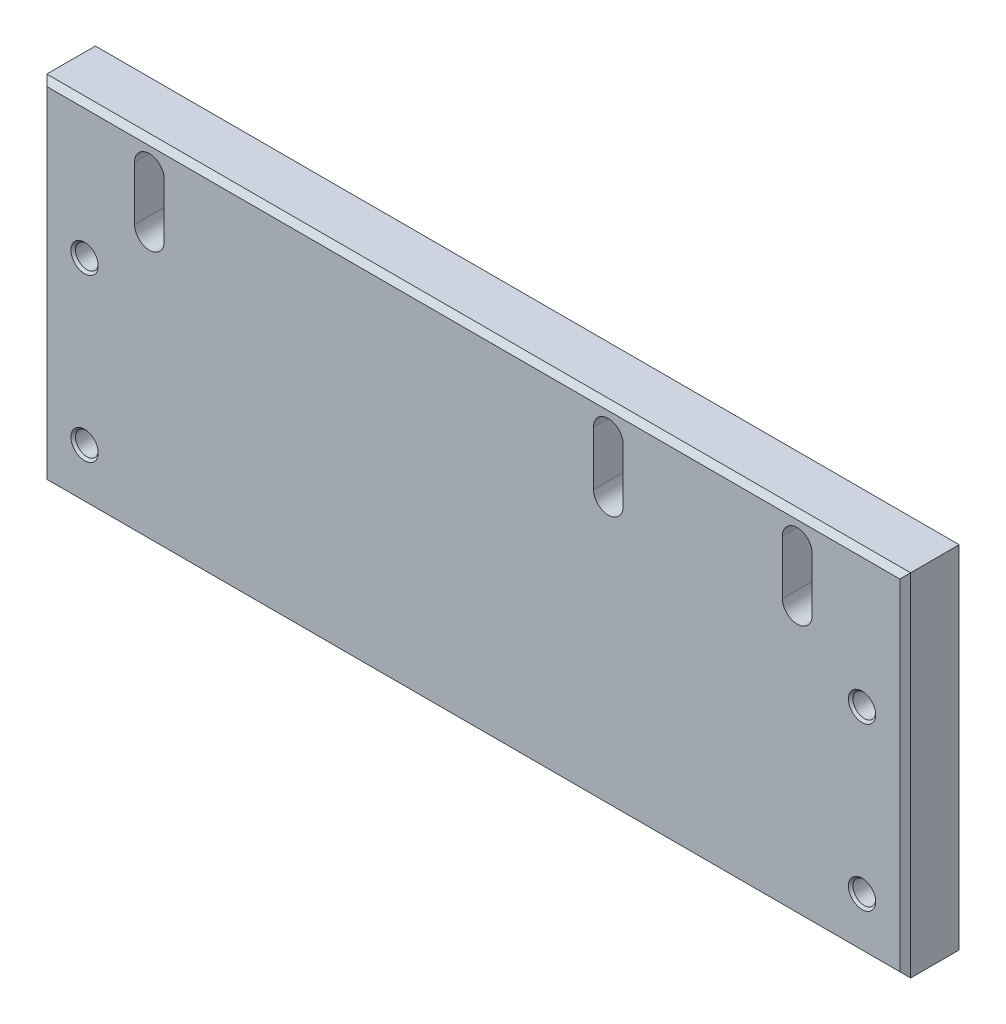
ISO-10303-21;
HEADER;
FILE_DESCRIPTION(('STEP AP214'),'2;1');
FILE_NAME('part.step','',(''),(''),'','','');
FILE_SCHEMA(('AUTOMOTIVE_DESIGN { 1 0 10303 214 1 1 1 1 }'));
ENDSEC;
DATA;
#1=APPLICATION_CONTEXT('core data for automotive mechanical design processes');
#2=APPLICATION_PROTOCOL_DEFINITION('international standard','automotive_design',2000,#1);
#3=PRODUCT_CONTEXT('',#1,'mechanical');
#4=PRODUCT('Part','Part','',(#3));
#5=PRODUCT_RELATED_PRODUCT_CATEGORY('part','',(#4));
#6=PRODUCT_DEFINITION_FORMATION('','',#4);
#7=PRODUCT_DEFINITION_CONTEXT('part definition',#1,'design');
#8=PRODUCT_DEFINITION('design','',#6,#7);
#9=PRODUCT_DEFINITION_SHAPE('','',#8);
#10=(LENGTH_UNIT() NAMED_UNIT(*) SI_UNIT(.MILLI.,.METRE.));
#11=(NAMED_UNIT(*) PLANE_ANGLE_UNIT() SI_UNIT($,.RADIAN.));
#12=(NAMED_UNIT(*) SI_UNIT($,.STERADIAN.) SOLID_ANGLE_UNIT());
#13=UNCERTAINTY_MEASURE_WITH_UNIT(LENGTH_MEASURE(1.E-05),#10,'distance_accuracy_value','');
#14=(GEOMETRIC_REPRESENTATION_CONTEXT(3) GLOBAL_UNCERTAINTY_ASSIGNED_CONTEXT((#13)) GLOBAL_UNIT_ASSIGNED_CONTEXT((#10,
#11,#12)) REPRESENTATION_CONTEXT('',''));
#15=CARTESIAN_POINT('',(0.,0.,0.));
#16=DIRECTION('',(0.,0.,1.));
#17=DIRECTION('',(1.,0.,0.));
#18=AXIS2_PLACEMENT_3D('',#15,#16,#17);
#19=CARTESIAN_POINT('',(-80.,32.5,10.));
#20=DIRECTION('',(1.,0.,0.));
#21=DIRECTION('',(0.,0.,-1.));
#22=AXIS2_PLACEMENT_3D('',#19,#20,#21);
#23=PLANE('',#22);
#24=DIRECTION('',(0.,0.,-1.));
#25=VECTOR('',#24,1.);
#26=CARTESIAN_POINT('',(-80.,-32.5,10.));
#27=LINE('',#26,#25);
#28=CARTESIAN_POINT('',(-80.,-32.5,9.));
#29=VERTEX_POINT('',#28);
#30=CARTESIAN_POINT('',(-80.,-32.5,0.));
#31=VERTEX_POINT('',#30);
#32=EDGE_CURVE('E314',#29,#31,#27,.T.);
#33=ORIENTED_EDGE('',*,*,#32,.F.);
#34=DIRECTION('',(0.,1.,0.));
#35=VECTOR('',#34,1.);
#36=CARTESIAN_POINT('',(-80.,32.5,9.));
#37=LINE('',#36,#35);
#38=CARTESIAN_POINT('',(-80.,32.5,9.));
#39=VERTEX_POINT('',#38);
#40=EDGE_CURVE('E45',#29,#39,#37,.T.);
#41=ORIENTED_EDGE('',*,*,#40,.T.);
#42=DIRECTION('',(0.,0.,-1.));
#43=VECTOR('',#42,1.);
#44=CARTESIAN_POINT('',(-80.,32.5,10.));
#45=LINE('',#44,#43);
#46=CARTESIAN_POINT('',(-80.,32.5,0.));
#47=VERTEX_POINT('',#46);
#48=EDGE_CURVE('E308',#39,#47,#45,.T.);
#49=ORIENTED_EDGE('',*,*,#48,.T.);
#50=DIRECTION('',(0.,-1.,0.));
#51=VECTOR('',#50,1.);
#52=CARTESIAN_POINT('',(-80.,32.5,0.));
#53=LINE('',#52,#51);
#54=EDGE_CURVE('E296',#47,#31,#53,.T.);
#55=ORIENTED_EDGE('',*,*,#54,.T.);
#56=EDGE_LOOP('',(#33,#41,#49,#55));
#57=FACE_BOUND('',#56,.T.);
#58=ADVANCED_FACE('F36',(#57),#23,.F.);
#59=CARTESIAN_POINT('',(-80.,-32.5,10.));
#60=DIRECTION('',(0.,1.,0.));
#61=DIRECTION('',(-1.,0.,0.));
#62=AXIS2_PLACEMENT_3D('',#59,#60,#61);
#63=PLANE('',#62);
#64=DIRECTION('',(0.,0.,-1.));
#65=VECTOR('',#64,1.);
#66=CARTESIAN_POINT('',(80.,-32.5,10.));
#67=LINE('',#66,#65);
#68=CARTESIAN_POINT('',(80.,-32.5,9.));
#69=VERTEX_POINT('',#68);
#70=CARTESIAN_POINT('',(80.,-32.5,0.));
#71=VERTEX_POINT('',#70);
#72=EDGE_CURVE('E312',#69,#71,#67,.T.);
#73=ORIENTED_EDGE('',*,*,#72,.F.);
#74=DIRECTION('',(-1.,0.,0.));
#75=VECTOR('',#74,1.);
#76=CARTESIAN_POINT('',(-80.,-32.5,9.));
#77=LINE('',#76,#75);
#78=EDGE_CURVE('E11',#69,#29,#77,.T.);
#79=ORIENTED_EDGE('',*,*,#78,.T.);
#80=ORIENTED_EDGE('',*,*,#32,.T.);
#81=DIRECTION('',(1.,0.,0.));
#82=VECTOR('',#81,1.);
#83=CARTESIAN_POINT('',(-80.,-32.5,0.));
#84=LINE('',#83,#82);
#85=EDGE_CURVE('E299',#31,#71,#84,.T.);
#86=ORIENTED_EDGE('',*,*,#85,.T.);
#87=EDGE_LOOP('',(#73,#79,#80,#86));
#88=FACE_BOUND('',#87,.T.);
#89=ADVANCED_FACE('F409',(#88),#63,.F.);
#90=CARTESIAN_POINT('',(80.,-32.5,10.));
#91=DIRECTION('',(-1.,0.,0.));
#92=DIRECTION('',(0.,0.,1.));
#93=AXIS2_PLACEMENT_3D('',#90,#91,#92);
#94=PLANE('',#93);
#95=DIRECTION('',(0.,0.,-1.));
#96=VECTOR('',#95,1.);
#97=CARTESIAN_POINT('',(80.,32.5,10.));
#98=LINE('',#97,#96);
#99=CARTESIAN_POINT('',(80.,32.5,9.));
#100=VERTEX_POINT('',#99);
#101=CARTESIAN_POINT('',(80.,32.5,0.));
#102=VERTEX_POINT('',#101);
#103=EDGE_CURVE('E310',#100,#102,#98,.T.);
#104=ORIENTED_EDGE('',*,*,#103,.F.);
#105=DIRECTION('',(0.,-1.,0.));
#106=VECTOR('',#105,1.);
#107=CARTESIAN_POINT('',(80.,-32.5,9.));
#108=LINE('',#107,#106);
#109=EDGE_CURVE('E333',#100,#69,#108,.T.);
#110=ORIENTED_EDGE('',*,*,#109,.T.);
#111=ORIENTED_EDGE('',*,*,#72,.T.);
#112=DIRECTION('',(0.,1.,0.));
#113=VECTOR('',#112,1.);
#114=CARTESIAN_POINT('',(80.,-32.5,0.));
#115=LINE('',#114,#113);
#116=EDGE_CURVE('E302',#71,#102,#115,.T.);
#117=ORIENTED_EDGE('',*,*,#116,.T.);
#118=EDGE_LOOP('',(#104,#110,#111,#117));
#119=FACE_BOUND('',#118,.T.);
#120=ADVANCED_FACE('F363',(#119),#94,.F.);
#121=CARTESIAN_POINT('',(80.,32.5,10.));
#122=DIRECTION('',(0.,-1.,0.));
#123=DIRECTION('',(1.,0.,0.));
#124=AXIS2_PLACEMENT_3D('',#121,#122,#123);
#125=PLANE('',#124);
#126=ORIENTED_EDGE('',*,*,#48,.F.);
#127=DIRECTION('',(1.,0.,0.));
#128=VECTOR('',#127,1.);
#129=CARTESIAN_POINT('',(80.,32.5,9.));
#130=LINE('',#129,#128);
#131=EDGE_CURVE('E336',#39,#100,#130,.T.);
#132=ORIENTED_EDGE('',*,*,#131,.T.);
#133=ORIENTED_EDGE('',*,*,#103,.T.);
#134=DIRECTION('',(-1.,0.,0.));
#135=VECTOR('',#134,1.);
#136=CARTESIAN_POINT('',(80.,32.5,0.));
#137=LINE('',#136,#135);
#138=EDGE_CURVE('E305',#102,#47,#137,.T.);
#139=ORIENTED_EDGE('',*,*,#138,.T.);
#140=EDGE_LOOP('',(#126,#132,#133,#139));
#141=FACE_BOUND('',#140,.T.);
#142=ADVANCED_FACE('F360',(#141),#125,.F.);
#143=CARTESIAN_POINT('',(-80.,-32.5,10.));
#144=DIRECTION('',(0.,0.,1.));
#145=DIRECTION('',(1.,0.,0.));
#146=AXIS2_PLACEMENT_3D('',#143,#144,#145);
#147=PLANE('',#146);
#148=DIRECTION('',(1.,0.,0.));
#149=VECTOR('',#148,1.);
#150=CARTESIAN_POINT('',(80.,-31.5,10.));
#151=LINE('',#150,#149);
#152=CARTESIAN_POINT('',(-79.,-31.5,10.));
#153=VERTEX_POINT('',#152);
#154=CARTESIAN_POINT('',(79.,-31.5,10.));
#155=VERTEX_POINT('',#154);
#156=EDGE_CURVE('E316',#153,#155,#151,.T.);
#157=ORIENTED_EDGE('',*,*,#156,.T.);
#158=DIRECTION('',(0.,1.,0.));
#159=VECTOR('',#158,1.);
#160=CARTESIAN_POINT('',(79.,32.5,10.));
#161=LINE('',#160,#159);
#162=CARTESIAN_POINT('',(79.,31.5,10.));
#163=VERTEX_POINT('',#162);
#164=EDGE_CURVE('E330',#155,#163,#161,.T.);
#165=ORIENTED_EDGE('',*,*,#164,.T.);
#166=DIRECTION('',(-1.,0.,0.));
#167=VECTOR('',#166,1.);
#168=CARTESIAN_POINT('',(-80.,31.5,10.));
#169=LINE('',#168,#167);
#170=CARTESIAN_POINT('',(-79.,31.5,10.));
#171=VERTEX_POINT('',#170);
#172=EDGE_CURVE('E328',#163,#171,#169,.T.);
#173=ORIENTED_EDGE('',*,*,#172,.T.);
#174=DIRECTION('',(0.,-1.,0.));
#175=VECTOR('',#174,1.);
#176=CARTESIAN_POINT('',(-79.,-32.5,10.));
#177=LINE('',#176,#175);
#178=EDGE_CURVE('E326',#171,#153,#177,.T.);
#179=ORIENTED_EDGE('',*,*,#178,.T.);
#180=EDGE_LOOP('',(#157,#165,#173,#179));
#181=FACE_BOUND('',#180,.T.);
#182=CARTESIAN_POINT('',(-60.,17.5000000000001,10.));
#183=DIRECTION('',(0.,0.,1.));
#184=DIRECTION('',(-1.,0.,0.));
#185=AXIS2_PLACEMENT_3D('',#182,#183,#184);
#186=CIRCLE('',#185,2.74999999999999);
#187=CARTESIAN_POINT('',(-62.75,17.5000000000001,10.));
#188=VERTEX_POINT('',#187);
#189=CARTESIAN_POINT('',(-57.25,17.5000000000001,10.));
#190=VERTEX_POINT('',#189);
#191=EDGE_CURVE('E168',#188,#190,#186,.T.);
#192=ORIENTED_EDGE('',*,*,#191,.F.);
#193=DIRECTION('',(0.,-1.,0.));
#194=VECTOR('',#193,1.);
#195=CARTESIAN_POINT('',(-62.75,17.5000000000001,10.));
#196=LINE('',#195,#194);
#197=CARTESIAN_POINT('',(-62.75,27.5,10.));
#198=VERTEX_POINT('',#197);
#199=EDGE_CURVE('E186',#198,#188,#196,.T.);
#200=ORIENTED_EDGE('',*,*,#199,.F.);
#201=CARTESIAN_POINT('',(-60.,27.5,10.));
#202=DIRECTION('',(0.,0.,1.));
#203=DIRECTION('',(-1.,0.,0.));
#204=AXIS2_PLACEMENT_3D('',#201,#202,#203);
#205=CIRCLE('',#204,2.74999999999999);
#206=CARTESIAN_POINT('',(-57.25,27.5,10.));
#207=VERTEX_POINT('',#206);
#208=EDGE_CURVE('E189',#207,#198,#205,.T.);
#209=ORIENTED_EDGE('',*,*,#208,.F.);
#210=DIRECTION('',(0.,1.,0.));
#211=VECTOR('',#210,1.);
#212=CARTESIAN_POINT('',(-57.25,17.5000000000001,10.));
#213=LINE('',#212,#211);
#214=EDGE_CURVE('E195',#190,#207,#213,.T.);
#215=ORIENTED_EDGE('',*,*,#214,.F.);
#216=EDGE_LOOP('',(#192,#200,#209,#215));
#217=FACE_BOUND('',#216,.T.);
#218=CARTESIAN_POINT('',(60.,17.5000000000001,10.));
#219=DIRECTION('',(0.,0.,1.));
#220=DIRECTION('',(1.,0.,0.));
#221=AXIS2_PLACEMENT_3D('',#218,#219,#220);
#222=CIRCLE('',#221,2.75);
#223=CARTESIAN_POINT('',(57.25,17.5000000000001,10.));
#224=VERTEX_POINT('',#223);
#225=CARTESIAN_POINT('',(62.75,17.5000000000001,10.));
#226=VERTEX_POINT('',#225);
#227=EDGE_CURVE('E201',#224,#226,#222,.T.);
#228=ORIENTED_EDGE('',*,*,#227,.F.);
#229=DIRECTION('',(0.,-1.,0.));
#230=VECTOR('',#229,1.);
#231=CARTESIAN_POINT('',(57.25,17.5000000000001,10.));
#232=LINE('',#231,#230);
#233=CARTESIAN_POINT('',(57.25,27.5,10.));
#234=VERTEX_POINT('',#233);
#235=EDGE_CURVE('E209',#234,#224,#232,.T.);
#236=ORIENTED_EDGE('',*,*,#235,.F.);
#237=CARTESIAN_POINT('',(60.,27.5,10.));
#238=DIRECTION('',(0.,0.,1.));
#239=DIRECTION('',(1.,0.,0.));
#240=AXIS2_PLACEMENT_3D('',#237,#238,#239);
#241=CIRCLE('',#240,2.75);
#242=CARTESIAN_POINT('',(62.75,27.5,10.));
#243=VERTEX_POINT('',#242);
#244=EDGE_CURVE('E223',#243,#234,#241,.T.);
#245=ORIENTED_EDGE('',*,*,#244,.F.);
#246=DIRECTION('',(0.,1.,0.));
#247=VECTOR('',#246,1.);
#248=CARTESIAN_POINT('',(62.75,17.5000000000001,10.));
#249=LINE('',#248,#247);
#250=EDGE_CURVE('E220',#226,#243,#249,.T.);
#251=ORIENTED_EDGE('',*,*,#250,.F.);
#252=EDGE_LOOP('',(#228,#236,#245,#251));
#253=FACE_BOUND('',#252,.T.);
#254=CARTESIAN_POINT('',(25.,27.5,10.));
#255=DIRECTION('',(0.,0.,1.));
#256=DIRECTION('',(1.,0.,0.));
#257=AXIS2_PLACEMENT_3D('',#254,#255,#256);
#258=CIRCLE('',#257,2.75);
#259=CARTESIAN_POINT('',(27.75,27.5,10.));
#260=VERTEX_POINT('',#259);
#261=CARTESIAN_POINT('',(22.25,27.5,10.));
#262=VERTEX_POINT('',#261);
#263=EDGE_CURVE('E230',#260,#262,#258,.T.);
#264=ORIENTED_EDGE('',*,*,#263,.F.);
#265=DIRECTION('',(0.,1.,0.));
#266=VECTOR('',#265,1.);
#267=CARTESIAN_POINT('',(27.75,27.5,10.));
#268=LINE('',#267,#266);
#269=CARTESIAN_POINT('',(27.75,17.5000000000001,10.));
#270=VERTEX_POINT('',#269);
#271=EDGE_CURVE('E241',#270,#260,#268,.T.);
#272=ORIENTED_EDGE('',*,*,#271,.F.);
#273=CARTESIAN_POINT('',(25.,17.5000000000001,10.));
#274=DIRECTION('',(0.,0.,1.));
#275=DIRECTION('',(1.,0.,0.));
#276=AXIS2_PLACEMENT_3D('',#273,#274,#275);
#277=CIRCLE('',#276,2.75);
#278=CARTESIAN_POINT('',(22.25,17.5000000000001,10.));
#279=VERTEX_POINT('',#278);
#280=EDGE_CURVE('E255',#279,#270,#277,.T.);
#281=ORIENTED_EDGE('',*,*,#280,.F.);
#282=DIRECTION('',(0.,-1.,0.));
#283=VECTOR('',#282,1.);
#284=CARTESIAN_POINT('',(22.25,27.5,10.));
#285=LINE('',#284,#283);
#286=EDGE_CURVE('E252',#262,#279,#285,.T.);
#287=ORIENTED_EDGE('',*,*,#286,.F.);
#288=EDGE_LOOP('',(#264,#272,#281,#287));
#289=FACE_BOUND('',#288,.T.);
#290=CARTESIAN_POINT('',(-72.,7.50000000000001,10.));
#291=DIRECTION('',(0.,0.,1.));
#292=DIRECTION('',(1.,0.,0.));
#293=AXIS2_PLACEMENT_3D('',#290,#291,#292);
#294=CIRCLE('',#293,2.525);
#295=CARTESIAN_POINT('',(-69.475,7.50000000000001,10.));
#296=VERTEX_POINT('',#295);
#297=EDGE_CURVE('E262',#296,#296,#294,.T.);
#298=ORIENTED_EDGE('',*,*,#297,.F.);
#299=EDGE_LOOP('',(#298));
#300=FACE_BOUND('',#299,.T.);
#301=CARTESIAN_POINT('',(-72.,-22.5,10.));
#302=DIRECTION('',(0.,0.,1.));
#303=DIRECTION('',(1.,0.,0.));
#304=AXIS2_PLACEMENT_3D('',#301,#302,#303);
#305=CIRCLE('',#304,2.525);
#306=CARTESIAN_POINT('',(-69.475,-22.5,10.));
#307=VERTEX_POINT('',#306);
#308=EDGE_CURVE('E275',#307,#307,#305,.T.);
#309=ORIENTED_EDGE('',*,*,#308,.F.);
#310=EDGE_LOOP('',(#309));
#311=FACE_BOUND('',#310,.T.);
#312=CARTESIAN_POINT('',(72.,-22.5,10.));
#313=DIRECTION('',(0.,0.,1.));
#314=DIRECTION('',(1.,0.,0.));
#315=AXIS2_PLACEMENT_3D('',#312,#313,#314);
#316=CIRCLE('',#315,2.525);
#317=CARTESIAN_POINT('',(74.525,-22.5,10.));
#318=VERTEX_POINT('',#317);
#319=EDGE_CURVE('E282',#318,#318,#316,.T.);
#320=ORIENTED_EDGE('',*,*,#319,.F.);
#321=EDGE_LOOP('',(#320));
#322=FACE_BOUND('',#321,.T.);
#323=CARTESIAN_POINT('',(72.,7.50000000000002,10.));
#324=DIRECTION('',(0.,0.,1.));
#325=DIRECTION('',(1.,0.,0.));
#326=AXIS2_PLACEMENT_3D('',#323,#324,#325);
#327=CIRCLE('',#326,2.525);
#328=CARTESIAN_POINT('',(74.525,7.50000000000002,10.));
#329=VERTEX_POINT('',#328);
#330=EDGE_CURVE('E289',#329,#329,#327,.T.);
#331=ORIENTED_EDGE('',*,*,#330,.F.);
#332=EDGE_LOOP('',(#331));
#333=FACE_BOUND('',#332,.T.);
#334=ADVANCED_FACE('F370',(#181,#217,#253,#289,#300,#311,#322,#333),#147,.T.);
#335=CARTESIAN_POINT('',(-80.,-32.5,0.));
#336=DIRECTION('',(0.,0.,1.));
#337=DIRECTION('',(1.,0.,0.));
#338=AXIS2_PLACEMENT_3D('',#335,#336,#337);
#339=PLANE('',#338);
#340=DIRECTION('',(0.,-1.,0.));
#341=VECTOR('',#340,1.);
#342=CARTESIAN_POINT('',(-62.75,17.5000000000001,0.));
#343=LINE('',#342,#341);
#344=CARTESIAN_POINT('',(-62.75,27.5,0.));
#345=VERTEX_POINT('',#344);
#346=CARTESIAN_POINT('',(-62.75,17.5000000000001,0.));
#347=VERTEX_POINT('',#346);
#348=EDGE_CURVE('E173',#345,#347,#343,.T.);
#349=ORIENTED_EDGE('',*,*,#348,.T.);
#350=CARTESIAN_POINT('',(-60.,17.5000000000001,0.));
#351=DIRECTION('',(0.,0.,1.));
#352=DIRECTION('',(-1.,0.,0.));
#353=AXIS2_PLACEMENT_3D('',#350,#351,#352);
#354=CIRCLE('',#353,2.74999999999999);
#355=CARTESIAN_POINT('',(-57.25,17.5000000000001,0.));
#356=VERTEX_POINT('',#355);
#357=EDGE_CURVE('E165',#347,#356,#354,.T.);
#358=ORIENTED_EDGE('',*,*,#357,.T.);
#359=DIRECTION('',(0.,1.,0.));
#360=VECTOR('',#359,1.);
#361=CARTESIAN_POINT('',(-57.25,17.5000000000001,0.));
#362=LINE('',#361,#360);
#363=CARTESIAN_POINT('',(-57.25,27.5,0.));
#364=VERTEX_POINT('',#363);
#365=EDGE_CURVE('E177',#356,#364,#362,.T.);
#366=ORIENTED_EDGE('',*,*,#365,.T.);
#367=CARTESIAN_POINT('',(-60.,27.5,0.));
#368=DIRECTION('',(0.,0.,1.));
#369=DIRECTION('',(-1.,0.,0.));
#370=AXIS2_PLACEMENT_3D('',#367,#368,#369);
#371=CIRCLE('',#370,2.74999999999999);
#372=EDGE_CURVE('E181',#364,#345,#371,.T.);
#373=ORIENTED_EDGE('',*,*,#372,.T.);
#374=EDGE_LOOP('',(#349,#358,#366,#373));
#375=FACE_BOUND('',#374,.T.);
#376=DIRECTION('',(0.,-1.,0.));
#377=VECTOR('',#376,1.);
#378=CARTESIAN_POINT('',(57.25,17.5000000000001,0.));
#379=LINE('',#378,#377);
#380=CARTESIAN_POINT('',(57.25,27.5,0.));
#381=VERTEX_POINT('',#380);
#382=CARTESIAN_POINT('',(57.25,17.5000000000001,0.));
#383=VERTEX_POINT('',#382);
#384=EDGE_CURVE('E215',#381,#383,#379,.T.);
#385=ORIENTED_EDGE('',*,*,#384,.T.);
#386=CARTESIAN_POINT('',(60.,17.5000000000001,0.));
#387=DIRECTION('',(0.,0.,1.));
#388=DIRECTION('',(1.,0.,0.));
#389=AXIS2_PLACEMENT_3D('',#386,#387,#388);
#390=CIRCLE('',#389,2.75);
#391=CARTESIAN_POINT('',(62.75,17.5000000000001,0.));
#392=VERTEX_POINT('',#391);
#393=EDGE_CURVE('E205',#383,#392,#390,.T.);
#394=ORIENTED_EDGE('',*,*,#393,.T.);
#395=DIRECTION('',(0.,1.,0.));
#396=VECTOR('',#395,1.);
#397=CARTESIAN_POINT('',(62.75,17.5000000000001,0.));
#398=LINE('',#397,#396);
#399=CARTESIAN_POINT('',(62.75,27.5,0.));
#400=VERTEX_POINT('',#399);
#401=EDGE_CURVE('E208',#392,#400,#398,.T.);
#402=ORIENTED_EDGE('',*,*,#401,.T.);
#403=CARTESIAN_POINT('',(60.,27.5,0.));
#404=DIRECTION('',(0.,0.,1.));
#405=DIRECTION('',(1.,0.,0.));
#406=AXIS2_PLACEMENT_3D('',#403,#404,#405);
#407=CIRCLE('',#406,2.75);
#408=EDGE_CURVE('E212',#400,#381,#407,.T.);
#409=ORIENTED_EDGE('',*,*,#408,.T.);
#410=EDGE_LOOP('',(#385,#394,#402,#409));
#411=FACE_BOUND('',#410,.T.);
#412=DIRECTION('',(0.,1.,0.));
#413=VECTOR('',#412,1.);
#414=CARTESIAN_POINT('',(27.75,27.5,0.));
#415=LINE('',#414,#413);
#416=CARTESIAN_POINT('',(27.75,17.5000000000001,0.));
#417=VERTEX_POINT('',#416);
#418=CARTESIAN_POINT('',(27.75,27.5,0.));
#419=VERTEX_POINT('',#418);
#420=EDGE_CURVE('E247',#417,#419,#415,.T.);
#421=ORIENTED_EDGE('',*,*,#420,.T.);
#422=CARTESIAN_POINT('',(25.,27.5,0.));
#423=DIRECTION('',(0.,0.,1.));
#424=DIRECTION('',(1.,0.,0.));
#425=AXIS2_PLACEMENT_3D('',#422,#423,#424);
#426=CIRCLE('',#425,2.75);
#427=CARTESIAN_POINT('',(22.25,27.5,0.));
#428=VERTEX_POINT('',#427);
#429=EDGE_CURVE('E237',#419,#428,#426,.T.);
#430=ORIENTED_EDGE('',*,*,#429,.T.);
#431=DIRECTION('',(0.,-1.,0.));
#432=VECTOR('',#431,1.);
#433=CARTESIAN_POINT('',(22.25,27.5,0.));
#434=LINE('',#433,#432);
#435=CARTESIAN_POINT('',(22.25,17.5000000000001,0.));
#436=VERTEX_POINT('',#435);
#437=EDGE_CURVE('E240',#428,#436,#434,.T.);
#438=ORIENTED_EDGE('',*,*,#437,.T.);
#439=CARTESIAN_POINT('',(25.,17.5000000000001,0.));
#440=DIRECTION('',(0.,0.,1.));
#441=DIRECTION('',(1.,0.,0.));
#442=AXIS2_PLACEMENT_3D('',#439,#440,#441);
#443=CIRCLE('',#442,2.75);
#444=EDGE_CURVE('E244',#436,#417,#443,.T.);
#445=ORIENTED_EDGE('',*,*,#444,.T.);
#446=EDGE_LOOP('',(#421,#430,#438,#445));
#447=FACE_BOUND('',#446,.T.);
#448=CARTESIAN_POINT('',(-72.,7.50000000000001,0.));
#449=DIRECTION('',(0.,0.,1.));
#450=DIRECTION('',(1.,0.,0.));
#451=AXIS2_PLACEMENT_3D('',#448,#449,#450);
#452=CIRCLE('',#451,2.1);
#453=CARTESIAN_POINT('',(-69.9,7.50000000000001,0.));
#454=VERTEX_POINT('',#453);
#455=EDGE_CURVE('E274',#454,#454,#452,.T.);
#456=ORIENTED_EDGE('',*,*,#455,.T.);
#457=EDGE_LOOP('',(#456));
#458=FACE_BOUND('',#457,.T.);
#459=CARTESIAN_POINT('',(-72.,-22.5,0.));
#460=DIRECTION('',(0.,0.,1.));
#461=DIRECTION('',(1.,0.,0.));
#462=AXIS2_PLACEMENT_3D('',#459,#460,#461);
#463=CIRCLE('',#462,2.1);
#464=CARTESIAN_POINT('',(-69.9,-22.5,0.));
#465=VERTEX_POINT('',#464);
#466=EDGE_CURVE('E281',#465,#465,#463,.T.);
#467=ORIENTED_EDGE('',*,*,#466,.T.);
#468=EDGE_LOOP('',(#467));
#469=FACE_BOUND('',#468,.T.);
#470=CARTESIAN_POINT('',(72.,-22.5,0.));
#471=DIRECTION('',(0.,0.,1.));
#472=DIRECTION('',(1.,0.,0.));
#473=AXIS2_PLACEMENT_3D('',#470,#471,#472);
#474=CIRCLE('',#473,2.1);
#475=CARTESIAN_POINT('',(74.1,-22.5,0.));
#476=VERTEX_POINT('',#475);
#477=EDGE_CURVE('E288',#476,#476,#474,.T.);
#478=ORIENTED_EDGE('',*,*,#477,.T.);
#479=EDGE_LOOP('',(#478));
#480=FACE_BOUND('',#479,.T.);
#481=CARTESIAN_POINT('',(72.,7.50000000000002,0.));
#482=DIRECTION('',(0.,0.,1.));
#483=DIRECTION('',(1.,0.,0.));
#484=AXIS2_PLACEMENT_3D('',#481,#482,#483);
#485=CIRCLE('',#484,2.1);
#486=CARTESIAN_POINT('',(74.1,7.50000000000002,0.));
#487=VERTEX_POINT('',#486);
#488=EDGE_CURVE('E295',#487,#487,#485,.T.);
#489=ORIENTED_EDGE('',*,*,#488,.T.);
#490=EDGE_LOOP('',(#489));
#491=FACE_BOUND('',#490,.T.);
#492=ORIENTED_EDGE('',*,*,#54,.F.);
#493=ORIENTED_EDGE('',*,*,#138,.F.);
#494=ORIENTED_EDGE('',*,*,#116,.F.);
#495=ORIENTED_EDGE('',*,*,#85,.F.);
#496=EDGE_LOOP('',(#492,#493,#494,#495));
#497=FACE_BOUND('',#496,.T.);
#498=ADVANCED_FACE('F183',(#375,#411,#447,#458,#469,#480,#491,#497),#339,.F.);
#499=CARTESIAN_POINT('',(72.,7.50000000000002,10.));
#500=DIRECTION('',(0.,0.,1.));
#501=DIRECTION('',(1.,0.,0.));
#502=AXIS2_PLACEMENT_3D('',#499,#500,#501);
#503=CYLINDRICAL_SURFACE('',#502,2.1);
#504=CARTESIAN_POINT('',(72.,7.50000000000002,9.575));
#505=DIRECTION('',(0.,0.,1.));
#506=DIRECTION('',(1.,0.,0.));
#507=AXIS2_PLACEMENT_3D('',#504,#505,#506);
#508=CIRCLE('',#507,2.1);
#509=CARTESIAN_POINT('',(74.1,7.50000000000002,9.575));
#510=VERTEX_POINT('',#509);
#511=EDGE_CURVE('E292',#510,#510,#508,.T.);
#512=ORIENTED_EDGE('',*,*,#511,.T.);
#513=EDGE_LOOP('',(#512));
#514=FACE_BOUND('',#513,.T.);
#515=ORIENTED_EDGE('',*,*,#488,.F.);
#516=EDGE_LOOP('',(#515));
#517=FACE_BOUND('',#516,.T.);
#518=ADVANCED_FACE('F395',(#514,#517),#503,.F.);
#519=CARTESIAN_POINT('',(72.,7.50000000000002,10.));
#520=DIRECTION('',(0.,0.,1.));
#521=DIRECTION('',(1.,0.,0.));
#522=AXIS2_PLACEMENT_3D('',#519,#520,#521);
#523=CONICAL_SURFACE('',#522,2.525,0.78539816339744);
#524=ORIENTED_EDGE('',*,*,#511,.F.);
#525=EDGE_LOOP('',(#524));
#526=FACE_BOUND('',#525,.T.);
#527=ORIENTED_EDGE('',*,*,#330,.T.);
#528=EDGE_LOOP('',(#527));
#529=FACE_BOUND('',#528,.T.);
#530=ADVANCED_FACE('F392',(#526,#529),#523,.F.);
#531=CARTESIAN_POINT('',(72.,-22.5,10.));
#532=DIRECTION('',(0.,0.,1.));
#533=DIRECTION('',(1.,0.,0.));
#534=AXIS2_PLACEMENT_3D('',#531,#532,#533);
#535=CYLINDRICAL_SURFACE('',#534,2.1);
#536=CARTESIAN_POINT('',(72.,-22.5,9.575));
#537=DIRECTION('',(0.,0.,1.));
#538=DIRECTION('',(1.,0.,0.));
#539=AXIS2_PLACEMENT_3D('',#536,#537,#538);
#540=CIRCLE('',#539,2.1);
#541=CARTESIAN_POINT('',(74.1,-22.5,9.575));
#542=VERTEX_POINT('',#541);
#543=EDGE_CURVE('E285',#542,#542,#540,.T.);
#544=ORIENTED_EDGE('',*,*,#543,.T.);
#545=EDGE_LOOP('',(#544));
#546=FACE_BOUND('',#545,.T.);
#547=ORIENTED_EDGE('',*,*,#477,.F.);
#548=EDGE_LOOP('',(#547));
#549=FACE_BOUND('',#548,.T.);
#550=ADVANCED_FACE('F394',(#546,#549),#535,.F.);
#551=CARTESIAN_POINT('',(72.,-22.5,10.));
#552=DIRECTION('',(0.,0.,1.));
#553=DIRECTION('',(1.,0.,0.));
#554=AXIS2_PLACEMENT_3D('',#551,#552,#553);
#555=CONICAL_SURFACE('',#554,2.525,0.78539816339744);
#556=ORIENTED_EDGE('',*,*,#543,.F.);
#557=EDGE_LOOP('',(#556));
#558=FACE_BOUND('',#557,.T.);
#559=ORIENTED_EDGE('',*,*,#319,.T.);
#560=EDGE_LOOP('',(#559));
#561=FACE_BOUND('',#560,.T.);
#562=ADVANCED_FACE('F402',(#558,#561),#555,.F.);
#563=CARTESIAN_POINT('',(-72.,-22.5,10.));
#564=DIRECTION('',(0.,0.,1.));
#565=DIRECTION('',(1.,0.,0.));
#566=AXIS2_PLACEMENT_3D('',#563,#564,#565);
#567=CYLINDRICAL_SURFACE('',#566,2.1);
#568=CARTESIAN_POINT('',(-72.,-22.5,9.575));
#569=DIRECTION('',(0.,0.,1.));
#570=DIRECTION('',(1.,0.,0.));
#571=AXIS2_PLACEMENT_3D('',#568,#569,#570);
#572=CIRCLE('',#571,2.1);
#573=CARTESIAN_POINT('',(-69.9,-22.5,9.575));
#574=VERTEX_POINT('',#573);
#575=EDGE_CURVE('E278',#574,#574,#572,.T.);
#576=ORIENTED_EDGE('',*,*,#575,.T.);
#577=EDGE_LOOP('',(#576));
#578=FACE_BOUND('',#577,.T.);
#579=ORIENTED_EDGE('',*,*,#466,.F.);
#580=EDGE_LOOP('',(#579));
#581=FACE_BOUND('',#580,.T.);
#582=ADVANCED_FACE('F482',(#578,#581),#567,.F.);
#583=CARTESIAN_POINT('',(-72.,-22.5,10.));
#584=DIRECTION('',(0.,0.,1.));
#585=DIRECTION('',(1.,0.,0.));
#586=AXIS2_PLACEMENT_3D('',#583,#584,#585);
#587=CONICAL_SURFACE('',#586,2.525,0.78539816339744);
#588=ORIENTED_EDGE('',*,*,#575,.F.);
#589=EDGE_LOOP('',(#588));
#590=FACE_BOUND('',#589,.T.);
#591=ORIENTED_EDGE('',*,*,#308,.T.);
#592=EDGE_LOOP('',(#591));
#593=FACE_BOUND('',#592,.T.);
#594=ADVANCED_FACE('F478',(#590,#593),#587,.F.);
#595=CARTESIAN_POINT('',(-72.,7.50000000000001,10.));
#596=DIRECTION('',(0.,0.,1.));
#597=DIRECTION('',(1.,0.,0.));
#598=AXIS2_PLACEMENT_3D('',#595,#596,#597);
#599=CYLINDRICAL_SURFACE('',#598,2.1);
#600=CARTESIAN_POINT('',(-72.,7.50000000000001,9.575));
#601=DIRECTION('',(0.,0.,1.));
#602=DIRECTION('',(1.,0.,0.));
#603=AXIS2_PLACEMENT_3D('',#600,#601,#602);
#604=CIRCLE('',#603,2.1);
#605=CARTESIAN_POINT('',(-69.9,7.50000000000001,9.575));
#606=VERTEX_POINT('',#605);
#607=EDGE_CURVE('E271',#606,#606,#604,.T.);
#608=ORIENTED_EDGE('',*,*,#607,.T.);
#609=EDGE_LOOP('',(#608));
#610=FACE_BOUND('',#609,.T.);
#611=ORIENTED_EDGE('',*,*,#455,.F.);
#612=EDGE_LOOP('',(#611));
#613=FACE_BOUND('',#612,.T.);
#614=ADVANCED_FACE('F474',(#610,#613),#599,.F.);
#615=CARTESIAN_POINT('',(-72.,7.50000000000001,10.));
#616=DIRECTION('',(0.,0.,1.));
#617=DIRECTION('',(1.,0.,0.));
#618=AXIS2_PLACEMENT_3D('',#615,#616,#617);
#619=CONICAL_SURFACE('',#618,2.525,0.78539816339744);
#620=ORIENTED_EDGE('',*,*,#607,.F.);
#621=EDGE_LOOP('',(#620));
#622=FACE_BOUND('',#621,.T.);
#623=ORIENTED_EDGE('',*,*,#297,.T.);
#624=EDGE_LOOP('',(#623));
#625=FACE_BOUND('',#624,.T.);
#626=ADVANCED_FACE('F470',(#622,#625),#619,.F.);
#627=CARTESIAN_POINT('',(25.,27.5,0.));
#628=DIRECTION('',(0.,0.,1.));
#629=DIRECTION('',(1.,0.,0.));
#630=AXIS2_PLACEMENT_3D('',#627,#628,#629);
#631=CYLINDRICAL_SURFACE('',#630,2.75);
#632=ORIENTED_EDGE('',*,*,#263,.T.);
#633=DIRECTION('',(0.,0.,1.));
#634=VECTOR('',#633,1.);
#635=CARTESIAN_POINT('',(22.25,27.5,0.));
#636=LINE('',#635,#634);
#637=EDGE_CURVE('E250',#428,#262,#636,.T.);
#638=ORIENTED_EDGE('',*,*,#637,.F.);
#639=ORIENTED_EDGE('',*,*,#429,.F.);
#640=DIRECTION('',(0.,0.,1.));
#641=VECTOR('',#640,1.);
#642=CARTESIAN_POINT('',(27.75,27.5,0.));
#643=LINE('',#642,#641);
#644=EDGE_CURVE('E260',#419,#260,#643,.T.);
#645=ORIENTED_EDGE('',*,*,#644,.T.);
#646=EDGE_LOOP('',(#632,#638,#639,#645));
#647=FACE_BOUND('',#646,.T.);
#648=ADVANCED_FACE('F460',(#647),#631,.F.);
#649=CARTESIAN_POINT('',(27.75,27.5,0.));
#650=DIRECTION('',(1.,0.,0.));
#651=DIRECTION('',(0.,1.,0.));
#652=AXIS2_PLACEMENT_3D('',#649,#650,#651);
#653=PLANE('',#652);
#654=ORIENTED_EDGE('',*,*,#271,.T.);
#655=ORIENTED_EDGE('',*,*,#644,.F.);
#656=ORIENTED_EDGE('',*,*,#420,.F.);
#657=DIRECTION('',(0.,0.,1.));
#658=VECTOR('',#657,1.);
#659=CARTESIAN_POINT('',(27.75,17.5000000000001,0.));
#660=LINE('',#659,#658);
#661=EDGE_CURVE('E263',#417,#270,#660,.T.);
#662=ORIENTED_EDGE('',*,*,#661,.T.);
#663=EDGE_LOOP('',(#654,#655,#656,#662));
#664=FACE_BOUND('',#663,.T.);
#665=ADVANCED_FACE('F456',(#664),#653,.F.);
#666=CARTESIAN_POINT('',(25.,17.5000000000001,0.));
#667=DIRECTION('',(0.,0.,1.));
#668=DIRECTION('',(1.,0.,0.));
#669=AXIS2_PLACEMENT_3D('',#666,#667,#668);
#670=CYLINDRICAL_SURFACE('',#669,2.75);
#671=ORIENTED_EDGE('',*,*,#280,.T.);
#672=ORIENTED_EDGE('',*,*,#661,.F.);
#673=ORIENTED_EDGE('',*,*,#444,.F.);
#674=DIRECTION('',(0.,0.,1.));
#675=VECTOR('',#674,1.);
#676=CARTESIAN_POINT('',(22.25,17.5000000000001,0.));
#677=LINE('',#676,#675);
#678=EDGE_CURVE('E265',#436,#279,#677,.T.);
#679=ORIENTED_EDGE('',*,*,#678,.T.);
#680=EDGE_LOOP('',(#671,#672,#673,#679));
#681=FACE_BOUND('',#680,.T.);
#682=ADVANCED_FACE('F459',(#681),#670,.F.);
#683=CARTESIAN_POINT('',(22.25,27.5,0.));
#684=DIRECTION('',(-1.,0.,0.));
#685=DIRECTION('',(0.,0.,1.));
#686=AXIS2_PLACEMENT_3D('',#683,#684,#685);
#687=PLANE('',#686);
#688=ORIENTED_EDGE('',*,*,#286,.T.);
#689=ORIENTED_EDGE('',*,*,#678,.F.);
#690=ORIENTED_EDGE('',*,*,#437,.F.);
#691=ORIENTED_EDGE('',*,*,#637,.T.);
#692=EDGE_LOOP('',(#688,#689,#690,#691));
#693=FACE_BOUND('',#692,.T.);
#694=ADVANCED_FACE('F454',(#693),#687,.F.);
#695=CARTESIAN_POINT('',(60.,17.5000000000001,0.));
#696=DIRECTION('',(0.,0.,1.));
#697=DIRECTION('',(1.,0.,0.));
#698=AXIS2_PLACEMENT_3D('',#695,#696,#697);
#699=CYLINDRICAL_SURFACE('',#698,2.75);
#700=ORIENTED_EDGE('',*,*,#227,.T.);
#701=DIRECTION('',(0.,0.,1.));
#702=VECTOR('',#701,1.);
#703=CARTESIAN_POINT('',(62.75,17.5000000000001,0.));
#704=LINE('',#703,#702);
#705=EDGE_CURVE('E218',#392,#226,#704,.T.);
#706=ORIENTED_EDGE('',*,*,#705,.F.);
#707=ORIENTED_EDGE('',*,*,#393,.F.);
#708=DIRECTION('',(0.,0.,1.));
#709=VECTOR('',#708,1.);
#710=CARTESIAN_POINT('',(57.25,17.5000000000001,0.));
#711=LINE('',#710,#709);
#712=EDGE_CURVE('E228',#383,#224,#711,.T.);
#713=ORIENTED_EDGE('',*,*,#712,.T.);
#714=EDGE_LOOP('',(#700,#706,#707,#713));
#715=FACE_BOUND('',#714,.T.);
#716=ADVANCED_FACE('F444',(#715),#699,.F.);
#717=CARTESIAN_POINT('',(57.25,17.5000000000001,0.));
#718=DIRECTION('',(-1.,0.,0.));
#719=DIRECTION('',(0.,0.,1.));
#720=AXIS2_PLACEMENT_3D('',#717,#718,#719);
#721=PLANE('',#720);
#722=ORIENTED_EDGE('',*,*,#235,.T.);
#723=ORIENTED_EDGE('',*,*,#712,.F.);
#724=ORIENTED_EDGE('',*,*,#384,.F.);
#725=DIRECTION('',(0.,0.,1.));
#726=VECTOR('',#725,1.);
#727=CARTESIAN_POINT('',(57.25,27.5,0.));
#728=LINE('',#727,#726);
#729=EDGE_CURVE('E231',#381,#234,#728,.T.);
#730=ORIENTED_EDGE('',*,*,#729,.T.);
#731=EDGE_LOOP('',(#722,#723,#724,#730));
#732=FACE_BOUND('',#731,.T.);
#733=ADVANCED_FACE('F440',(#732),#721,.F.);
#734=CARTESIAN_POINT('',(60.,27.5,0.));
#735=DIRECTION('',(0.,0.,1.));
#736=DIRECTION('',(1.,0.,0.));
#737=AXIS2_PLACEMENT_3D('',#734,#735,#736);
#738=CYLINDRICAL_SURFACE('',#737,2.75);
#739=ORIENTED_EDGE('',*,*,#244,.T.);
#740=ORIENTED_EDGE('',*,*,#729,.F.);
#741=ORIENTED_EDGE('',*,*,#408,.F.);
#742=DIRECTION('',(0.,0.,1.));
#743=VECTOR('',#742,1.);
#744=CARTESIAN_POINT('',(62.75,27.5,0.));
#745=LINE('',#744,#743);
#746=EDGE_CURVE('E233',#400,#243,#745,.T.);
#747=ORIENTED_EDGE('',*,*,#746,.T.);
#748=EDGE_LOOP('',(#739,#740,#741,#747));
#749=FACE_BOUND('',#748,.T.);
#750=ADVANCED_FACE('F443',(#749),#738,.F.);
#751=CARTESIAN_POINT('',(62.75,17.5000000000001,0.));
#752=DIRECTION('',(1.,0.,0.));
#753=DIRECTION('',(0.,0.,-1.));
#754=AXIS2_PLACEMENT_3D('',#751,#752,#753);
#755=PLANE('',#754);
#756=ORIENTED_EDGE('',*,*,#250,.T.);
#757=ORIENTED_EDGE('',*,*,#746,.F.);
#758=ORIENTED_EDGE('',*,*,#401,.F.);
#759=ORIENTED_EDGE('',*,*,#705,.T.);
#760=EDGE_LOOP('',(#756,#757,#758,#759));
#761=FACE_BOUND('',#760,.T.);
#762=ADVANCED_FACE('F439',(#761),#755,.F.);
#763=CARTESIAN_POINT('',(-60.,17.5000000000001,0.));
#764=DIRECTION('',(0.,0.,1.));
#765=DIRECTION('',(1.,0.,0.));
#766=AXIS2_PLACEMENT_3D('',#763,#764,#765);
#767=CYLINDRICAL_SURFACE('',#766,2.74999999999999);
#768=ORIENTED_EDGE('',*,*,#191,.T.);
#769=DIRECTION('',(0.,0.,1.));
#770=VECTOR('',#769,1.);
#771=CARTESIAN_POINT('',(-57.25,17.5000000000001,0.));
#772=LINE('',#771,#770);
#773=EDGE_CURVE('E161',#356,#190,#772,.T.);
#774=ORIENTED_EDGE('',*,*,#773,.F.);
#775=ORIENTED_EDGE('',*,*,#357,.F.);
#776=DIRECTION('',(0.,0.,1.));
#777=VECTOR('',#776,1.);
#778=CARTESIAN_POINT('',(-62.75,17.5000000000001,0.));
#779=LINE('',#778,#777);
#780=EDGE_CURVE('E199',#347,#188,#779,.T.);
#781=ORIENTED_EDGE('',*,*,#780,.T.);
#782=EDGE_LOOP('',(#768,#774,#775,#781));
#783=FACE_BOUND('',#782,.T.);
#784=ADVANCED_FACE('F163',(#783),#767,.F.);
#785=CARTESIAN_POINT('',(-62.75,17.5000000000001,0.));
#786=DIRECTION('',(-1.,0.,0.));
#787=DIRECTION('',(0.,-1.,0.));
#788=AXIS2_PLACEMENT_3D('',#785,#786,#787);
#789=PLANE('',#788);
#790=ORIENTED_EDGE('',*,*,#199,.T.);
#791=ORIENTED_EDGE('',*,*,#780,.F.);
#792=ORIENTED_EDGE('',*,*,#348,.F.);
#793=DIRECTION('',(0.,0.,1.));
#794=VECTOR('',#793,1.);
#795=CARTESIAN_POINT('',(-62.75,27.5,0.));
#796=LINE('',#795,#794);
#797=EDGE_CURVE('E202',#345,#198,#796,.T.);
#798=ORIENTED_EDGE('',*,*,#797,.T.);
#799=EDGE_LOOP('',(#790,#791,#792,#798));
#800=FACE_BOUND('',#799,.T.);
#801=ADVANCED_FACE('F432',(#800),#789,.F.);
#802=CARTESIAN_POINT('',(-60.,27.5,0.));
#803=DIRECTION('',(0.,0.,1.));
#804=DIRECTION('',(1.,0.,0.));
#805=AXIS2_PLACEMENT_3D('',#802,#803,#804);
#806=CYLINDRICAL_SURFACE('',#805,2.74999999999999);
#807=ORIENTED_EDGE('',*,*,#208,.T.);
#808=ORIENTED_EDGE('',*,*,#797,.F.);
#809=ORIENTED_EDGE('',*,*,#372,.F.);
#810=DIRECTION('',(0.,0.,1.));
#811=VECTOR('',#810,1.);
#812=CARTESIAN_POINT('',(-57.25,27.5,0.));
#813=LINE('',#812,#811);
#814=EDGE_CURVE('E172',#364,#207,#813,.T.);
#815=ORIENTED_EDGE('',*,*,#814,.T.);
#816=EDGE_LOOP('',(#807,#808,#809,#815));
#817=FACE_BOUND('',#816,.T.);
#818=ADVANCED_FACE('F427',(#817),#806,.F.);
#819=CARTESIAN_POINT('',(-57.25,17.5000000000001,0.));
#820=DIRECTION('',(1.,0.,0.));
#821=DIRECTION('',(0.,1.,0.));
#822=AXIS2_PLACEMENT_3D('',#819,#820,#821);
#823=PLANE('',#822);
#824=ORIENTED_EDGE('',*,*,#214,.T.);
#825=ORIENTED_EDGE('',*,*,#814,.F.);
#826=ORIENTED_EDGE('',*,*,#365,.F.);
#827=ORIENTED_EDGE('',*,*,#773,.T.);
#828=EDGE_LOOP('',(#824,#825,#826,#827));
#829=FACE_BOUND('',#828,.T.);
#830=ADVANCED_FACE('F178',(#829),#823,.F.);
#831=CARTESIAN_POINT('',(-79.,-32.5,10.));
#832=DIRECTION('',(-0.707106781186552,0.,0.707106781186543));
#833=DIRECTION('',(0.707106781186543,0.,0.707106781186552));
#834=AXIS2_PLACEMENT_3D('',#831,#832,#833);
#835=PLANE('',#834);
#836=DIRECTION('',(-0.577350269189625,0.57735026918962,-0.577350269189633));
#837=VECTOR('',#836,1.);
#838=CARTESIAN_POINT('',(-57.6666666666669,10.1666666666671,31.3333333333334));
#839=LINE('',#838,#837);
#840=EDGE_CURVE('E342',#39,#171,#839,.F.);
#841=ORIENTED_EDGE('',*,*,#840,.F.);
#842=ORIENTED_EDGE('',*,*,#40,.F.);
#843=DIRECTION('',(-0.577350269189623,-0.577350269189623,-0.577350269189631));
#844=VECTOR('',#843,1.);
#845=CARTESIAN_POINT('',(-79.3333333333333,-31.8333333333334,9.66666666666667));
#846=LINE('',#845,#844);
#847=EDGE_CURVE('E40',#153,#29,#846,.T.);
#848=ORIENTED_EDGE('',*,*,#847,.F.);
#849=ORIENTED_EDGE('',*,*,#178,.F.);
#850=EDGE_LOOP('',(#841,#842,#848,#849));
#851=FACE_BOUND('',#850,.T.);
#852=ADVANCED_FACE('F38',(#851),#835,.T.);
#853=CARTESIAN_POINT('',(-80.,-31.5,10.));
#854=DIRECTION('',(0.,-0.707106781186552,0.707106781186543));
#855=DIRECTION('',(0.,-0.707106781186543,-0.707106781186552));
#856=AXIS2_PLACEMENT_3D('',#853,#854,#855);
#857=PLANE('',#856);
#858=ORIENTED_EDGE('',*,*,#847,.T.);
#859=ORIENTED_EDGE('',*,*,#78,.F.);
#860=DIRECTION('',(-0.577350269189618,0.577350269189626,0.577350269189634));
#861=VECTOR('',#860,1.);
#862=CARTESIAN_POINT('',(26.0000000000015,21.4999999999993,63.));
#863=LINE('',#862,#861);
#864=EDGE_CURVE('E341',#155,#69,#863,.F.);
#865=ORIENTED_EDGE('',*,*,#864,.F.);
#866=ORIENTED_EDGE('',*,*,#156,.F.);
#867=EDGE_LOOP('',(#858,#859,#865,#866));
#868=FACE_BOUND('',#867,.T.);
#869=ADVANCED_FACE('F352',(#868),#857,.T.);
#870=CARTESIAN_POINT('',(-80.,31.5,10.));
#871=DIRECTION('',(0.,0.707106781186555,0.70710678118654));
#872=DIRECTION('',(0.,-0.70710678118654,0.707106781186555));
#873=AXIS2_PLACEMENT_3D('',#870,#871,#872);
#874=PLANE('',#873);
#875=ORIENTED_EDGE('',*,*,#840,.T.);
#876=ORIENTED_EDGE('',*,*,#172,.F.);
#877=DIRECTION('',(0.577350269189619,0.577350269189623,-0.577350269189635));
#878=VECTOR('',#877,1.);
#879=CARTESIAN_POINT('',(26.0000000000012,-21.4999999999991,63.0000000000003));
#880=LINE('',#879,#878);
#881=EDGE_CURVE('E339',#100,#163,#880,.F.);
#882=ORIENTED_EDGE('',*,*,#881,.F.);
#883=ORIENTED_EDGE('',*,*,#131,.F.);
#884=EDGE_LOOP('',(#875,#876,#882,#883));
#885=FACE_BOUND('',#884,.T.);
#886=ADVANCED_FACE('F357',(#885),#874,.T.);
#887=CARTESIAN_POINT('',(79.,-32.5,10.));
#888=DIRECTION('',(0.707106781186557,0.,0.707106781186538));
#889=DIRECTION('',(0.707106781186538,0.,-0.707106781186557));
#890=AXIS2_PLACEMENT_3D('',#887,#888,#889);
#891=PLANE('',#890);
#892=ORIENTED_EDGE('',*,*,#864,.T.);
#893=ORIENTED_EDGE('',*,*,#109,.F.);
#894=ORIENTED_EDGE('',*,*,#881,.T.);
#895=ORIENTED_EDGE('',*,*,#164,.F.);
#896=EDGE_LOOP('',(#892,#893,#894,#895));
#897=FACE_BOUND('',#896,.T.);
#898=ADVANCED_FACE('F367',(#897),#891,.T.);
#899=CLOSED_SHELL('',(#58,#89,#120,#142,#334,#498,#518,#530,#550,#562,#582,#594,#614,#626,#648,
#665,#682,#694,#716,#733,#750,#762,#784,#801,#818,#830,#852,#869,#886,#898));
#900=MANIFOLD_SOLID_BREP('B2',#899);
#901=ADVANCED_BREP_SHAPE_REPRESENTATION('',(#18,#900),#14);
#902=SHAPE_DEFINITION_REPRESENTATION(#9,#901);
ENDSEC;
END-ISO-10303-21;
